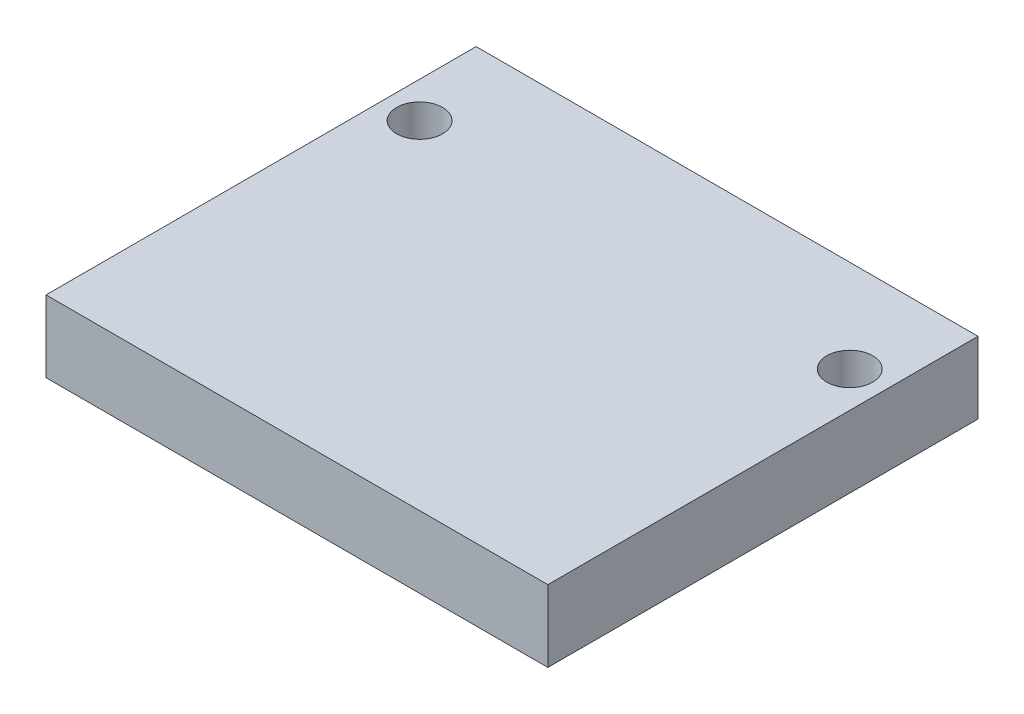
ISO-10303-21;
HEADER;
FILE_DESCRIPTION(('STEP AP214'),'2;1');
FILE_NAME('part.step','',(''),(''),'','','');
FILE_SCHEMA(('AUTOMOTIVE_DESIGN { 1 0 10303 214 1 1 1 1 }'));
ENDSEC;
DATA;
#1=APPLICATION_CONTEXT('core data for automotive mechanical design processes');
#2=APPLICATION_PROTOCOL_DEFINITION('international standard','automotive_design',2000,#1);
#3=PRODUCT_CONTEXT('',#1,'mechanical');
#4=PRODUCT('Part','Part','',(#3));
#5=PRODUCT_RELATED_PRODUCT_CATEGORY('part','',(#4));
#6=PRODUCT_DEFINITION_FORMATION('','',#4);
#7=PRODUCT_DEFINITION_CONTEXT('part definition',#1,'design');
#8=PRODUCT_DEFINITION('design','',#6,#7);
#9=PRODUCT_DEFINITION_SHAPE('','',#8);
#10=(LENGTH_UNIT() NAMED_UNIT(*) SI_UNIT(.MILLI.,.METRE.));
#11=(NAMED_UNIT(*) PLANE_ANGLE_UNIT() SI_UNIT($,.RADIAN.));
#12=(NAMED_UNIT(*) SI_UNIT($,.STERADIAN.) SOLID_ANGLE_UNIT());
#13=UNCERTAINTY_MEASURE_WITH_UNIT(LENGTH_MEASURE(1.E-05),#10,'distance_accuracy_value','');
#14=(GEOMETRIC_REPRESENTATION_CONTEXT(3) GLOBAL_UNCERTAINTY_ASSIGNED_CONTEXT((#13)) GLOBAL_UNIT_ASSIGNED_CONTEXT((#10,
#11,#12)) REPRESENTATION_CONTEXT('',''));
#15=CARTESIAN_POINT('',(0.,0.,0.));
#16=DIRECTION('',(0.,0.,1.));
#17=DIRECTION('',(1.,0.,0.));
#18=AXIS2_PLACEMENT_3D('',#15,#16,#17);
#19=CARTESIAN_POINT('',(17.5,2.5,30.));
#20=DIRECTION('',(-1.,0.,0.));
#21=DIRECTION('',(0.,0.,1.));
#22=AXIS2_PLACEMENT_3D('',#19,#20,#21);
#23=PLANE('',#22);
#24=DIRECTION('',(0.,1.,0.));
#25=VECTOR('',#24,1.);
#26=CARTESIAN_POINT('',(17.5,2.5,0.));
#27=LINE('',#26,#25);
#28=CARTESIAN_POINT('',(17.5,-2.5,0.));
#29=VERTEX_POINT('',#28);
#30=CARTESIAN_POINT('',(17.5,2.5,0.));
#31=VERTEX_POINT('',#30);
#32=EDGE_CURVE('E107',#29,#31,#27,.T.);
#33=ORIENTED_EDGE('',*,*,#32,.T.);
#34=DIRECTION('',(0.,0.,-1.));
#35=VECTOR('',#34,1.);
#36=CARTESIAN_POINT('',(17.5,2.5,30.));
#37=LINE('',#36,#35);
#38=CARTESIAN_POINT('',(17.5,2.5,30.));
#39=VERTEX_POINT('',#38);
#40=EDGE_CURVE('E11',#39,#31,#37,.T.);
#41=ORIENTED_EDGE('',*,*,#40,.F.);
#42=DIRECTION('',(0.,1.,0.));
#43=VECTOR('',#42,1.);
#44=CARTESIAN_POINT('',(17.5,2.5,30.));
#45=LINE('',#44,#43);
#46=CARTESIAN_POINT('',(17.5,-2.5,30.));
#47=VERTEX_POINT('',#46);
#48=EDGE_CURVE('E94',#47,#39,#45,.T.);
#49=ORIENTED_EDGE('',*,*,#48,.F.);
#50=DIRECTION('',(0.,0.,-1.));
#51=VECTOR('',#50,1.);
#52=CARTESIAN_POINT('',(17.5,-2.5,30.));
#53=LINE('',#52,#51);
#54=EDGE_CURVE('E103',#47,#29,#53,.T.);
#55=ORIENTED_EDGE('',*,*,#54,.T.);
#56=EDGE_LOOP('',(#33,#41,#49,#55));
#57=FACE_BOUND('',#56,.T.);
#58=ADVANCED_FACE('F41',(#57),#23,.F.);
#59=CARTESIAN_POINT('',(-17.5,2.5,30.));
#60=DIRECTION('',(0.,-1.,0.));
#61=DIRECTION('',(0.,0.,-1.));
#62=AXIS2_PLACEMENT_3D('',#59,#60,#61);
#63=PLANE('',#62);
#64=CARTESIAN_POINT('',(14.9999999999965,2.5,6.44504003723592));
#65=DIRECTION('',(0.,1.,0.));
#66=DIRECTION('',(0.,0.,1.));
#67=AXIS2_PLACEMENT_3D('',#64,#65,#66);
#68=CIRCLE('',#67,1.6);
#69=CARTESIAN_POINT('',(14.9999999999965,2.5,8.04504003723592));
#70=VERTEX_POINT('',#69);
#71=EDGE_CURVE('E116',#70,#70,#68,.T.);
#72=ORIENTED_EDGE('',*,*,#71,.F.);
#73=EDGE_LOOP('',(#72));
#74=FACE_BOUND('',#73,.T.);
#75=CARTESIAN_POINT('',(-15.0000000000035,2.5,6.44504003723609));
#76=DIRECTION('',(0.,1.,0.));
#77=DIRECTION('',(0.,0.,1.));
#78=AXIS2_PLACEMENT_3D('',#75,#76,#77);
#79=CIRCLE('',#78,1.6);
#80=CARTESIAN_POINT('',(-15.0000000000035,2.5,8.04504003723609));
#81=VERTEX_POINT('',#80);
#82=EDGE_CURVE('E121',#81,#81,#79,.T.);
#83=ORIENTED_EDGE('',*,*,#82,.F.);
#84=EDGE_LOOP('',(#83));
#85=FACE_BOUND('',#84,.T.);
#86=DIRECTION('',(-1.,0.,0.));
#87=VECTOR('',#86,1.);
#88=CARTESIAN_POINT('',(-17.5,2.5,0.));
#89=LINE('',#88,#87);
#90=CARTESIAN_POINT('',(-17.5,2.5,0.));
#91=VERTEX_POINT('',#90);
#92=EDGE_CURVE('E98',#31,#91,#89,.T.);
#93=ORIENTED_EDGE('',*,*,#92,.T.);
#94=DIRECTION('',(0.,0.,-1.));
#95=VECTOR('',#94,1.);
#96=CARTESIAN_POINT('',(-17.5,2.5,30.));
#97=LINE('',#96,#95);
#98=CARTESIAN_POINT('',(-17.5,2.5,30.));
#99=VERTEX_POINT('',#98);
#100=EDGE_CURVE('E50',#99,#91,#97,.T.);
#101=ORIENTED_EDGE('',*,*,#100,.F.);
#102=DIRECTION('',(-1.,0.,0.));
#103=VECTOR('',#102,1.);
#104=CARTESIAN_POINT('',(-17.5,2.5,30.));
#105=LINE('',#104,#103);
#106=EDGE_CURVE('E89',#39,#99,#105,.T.);
#107=ORIENTED_EDGE('',*,*,#106,.F.);
#108=ORIENTED_EDGE('',*,*,#40,.T.);
#109=EDGE_LOOP('',(#93,#101,#107,#108));
#110=FACE_BOUND('',#109,.T.);
#111=ADVANCED_FACE('F97',(#74,#85,#110),#63,.F.);
#112=CARTESIAN_POINT('',(-17.5,2.5,30.));
#113=DIRECTION('',(1.,0.,0.));
#114=DIRECTION('',(0.,0.,-1.));
#115=AXIS2_PLACEMENT_3D('',#112,#113,#114);
#116=PLANE('',#115);
#117=DIRECTION('',(0.,-1.,0.));
#118=VECTOR('',#117,1.);
#119=CARTESIAN_POINT('',(-17.5,2.5,0.));
#120=LINE('',#119,#118);
#121=CARTESIAN_POINT('',(-17.5,-2.5,0.));
#122=VERTEX_POINT('',#121);
#123=EDGE_CURVE('E76',#91,#122,#120,.T.);
#124=ORIENTED_EDGE('',*,*,#123,.T.);
#125=DIRECTION('',(0.,0.,-1.));
#126=VECTOR('',#125,1.);
#127=CARTESIAN_POINT('',(-17.5,-2.5,30.));
#128=LINE('',#127,#126);
#129=CARTESIAN_POINT('',(-17.5,-2.5,30.));
#130=VERTEX_POINT('',#129);
#131=EDGE_CURVE('E99',#130,#122,#128,.T.);
#132=ORIENTED_EDGE('',*,*,#131,.F.);
#133=DIRECTION('',(0.,-1.,0.));
#134=VECTOR('',#133,1.);
#135=CARTESIAN_POINT('',(-17.5,2.5,30.));
#136=LINE('',#135,#134);
#137=EDGE_CURVE('E92',#99,#130,#136,.T.);
#138=ORIENTED_EDGE('',*,*,#137,.F.);
#139=ORIENTED_EDGE('',*,*,#100,.T.);
#140=EDGE_LOOP('',(#124,#132,#138,#139));
#141=FACE_BOUND('',#140,.T.);
#142=ADVANCED_FACE('F101',(#141),#116,.F.);
#143=CARTESIAN_POINT('',(-17.5,-2.5,30.));
#144=DIRECTION('',(0.,1.,0.));
#145=DIRECTION('',(0.,0.,1.));
#146=AXIS2_PLACEMENT_3D('',#143,#144,#145);
#147=PLANE('',#146);
#148=CARTESIAN_POINT('',(14.9999999999965,-2.5,6.44504003723592));
#149=DIRECTION('',(0.,1.,0.));
#150=DIRECTION('',(0.,0.,1.));
#151=AXIS2_PLACEMENT_3D('',#148,#149,#150);
#152=CIRCLE('',#151,1.6);
#153=CARTESIAN_POINT('',(14.9999999999965,-2.5,8.04504003723592));
#154=VERTEX_POINT('',#153);
#155=EDGE_CURVE('E44',#154,#154,#152,.T.);
#156=ORIENTED_EDGE('',*,*,#155,.T.);
#157=EDGE_LOOP('',(#156));
#158=FACE_BOUND('',#157,.T.);
#159=CARTESIAN_POINT('',(-15.0000000000035,-2.5,6.44504003723609));
#160=DIRECTION('',(0.,1.,0.));
#161=DIRECTION('',(0.,0.,1.));
#162=AXIS2_PLACEMENT_3D('',#159,#160,#161);
#163=CIRCLE('',#162,1.6);
#164=CARTESIAN_POINT('',(-15.0000000000035,-2.5,8.04504003723609));
#165=VERTEX_POINT('',#164);
#166=EDGE_CURVE('E114',#165,#165,#163,.T.);
#167=ORIENTED_EDGE('',*,*,#166,.T.);
#168=EDGE_LOOP('',(#167));
#169=FACE_BOUND('',#168,.T.);
#170=DIRECTION('',(1.,0.,0.));
#171=VECTOR('',#170,1.);
#172=CARTESIAN_POINT('',(-17.5,-2.5,0.));
#173=LINE('',#172,#171);
#174=EDGE_CURVE('E82',#122,#29,#173,.T.);
#175=ORIENTED_EDGE('',*,*,#174,.T.);
#176=ORIENTED_EDGE('',*,*,#54,.F.);
#177=DIRECTION('',(1.,0.,0.));
#178=VECTOR('',#177,1.);
#179=CARTESIAN_POINT('',(-17.5,-2.5,30.));
#180=LINE('',#179,#178);
#181=EDGE_CURVE('E59',#130,#47,#180,.T.);
#182=ORIENTED_EDGE('',*,*,#181,.F.);
#183=ORIENTED_EDGE('',*,*,#131,.T.);
#184=EDGE_LOOP('',(#175,#176,#182,#183));
#185=FACE_BOUND('',#184,.T.);
#186=ADVANCED_FACE('F139',(#158,#169,#185),#147,.F.);
#187=CARTESIAN_POINT('',(0.,0.,30.));
#188=DIRECTION('',(0.,0.,1.));
#189=DIRECTION('',(1.,0.,0.));
#190=AXIS2_PLACEMENT_3D('',#187,#188,#189);
#191=PLANE('',#190);
#192=ORIENTED_EDGE('',*,*,#48,.T.);
#193=ORIENTED_EDGE('',*,*,#106,.T.);
#194=ORIENTED_EDGE('',*,*,#137,.T.);
#195=ORIENTED_EDGE('',*,*,#181,.T.);
#196=EDGE_LOOP('',(#192,#193,#194,#195));
#197=FACE_BOUND('',#196,.T.);
#198=ADVANCED_FACE('F90',(#197),#191,.T.);
#199=CARTESIAN_POINT('',(0.,0.,0.));
#200=DIRECTION('',(0.,0.,1.));
#201=DIRECTION('',(1.,0.,0.));
#202=AXIS2_PLACEMENT_3D('',#199,#200,#201);
#203=PLANE('',#202);
#204=ORIENTED_EDGE('',*,*,#32,.F.);
#205=ORIENTED_EDGE('',*,*,#174,.F.);
#206=ORIENTED_EDGE('',*,*,#123,.F.);
#207=ORIENTED_EDGE('',*,*,#92,.F.);
#208=EDGE_LOOP('',(#204,#205,#206,#207));
#209=FACE_BOUND('',#208,.T.);
#210=ADVANCED_FACE('F146',(#209),#203,.F.);
#211=CARTESIAN_POINT('',(-15.0000000000035,-7.5,6.44504003723609));
#212=DIRECTION('',(0.,1.,0.));
#213=DIRECTION('',(0.,0.,1.));
#214=AXIS2_PLACEMENT_3D('',#211,#212,#213);
#215=CYLINDRICAL_SURFACE('',#214,1.6);
#216=ORIENTED_EDGE('',*,*,#82,.T.);
#217=EDGE_LOOP('',(#216));
#218=FACE_BOUND('',#217,.T.);
#219=ORIENTED_EDGE('',*,*,#166,.F.);
#220=EDGE_LOOP('',(#219));
#221=FACE_BOUND('',#220,.T.);
#222=ADVANCED_FACE('F129',(#218,#221),#215,.F.);
#223=CARTESIAN_POINT('',(14.9999999999965,-7.5,6.44504003723592));
#224=DIRECTION('',(0.,1.,0.));
#225=DIRECTION('',(0.,0.,1.));
#226=AXIS2_PLACEMENT_3D('',#223,#224,#225);
#227=CYLINDRICAL_SURFACE('',#226,1.6);
#228=ORIENTED_EDGE('',*,*,#71,.T.);
#229=EDGE_LOOP('',(#228));
#230=FACE_BOUND('',#229,.T.);
#231=ORIENTED_EDGE('',*,*,#155,.F.);
#232=EDGE_LOOP('',(#231));
#233=FACE_BOUND('',#232,.T.);
#234=ADVANCED_FACE('F154',(#230,#233),#227,.F.);
#235=CLOSED_SHELL('',(#58,#111,#142,#186,#198,#210,#222,#234));
#236=MANIFOLD_SOLID_BREP('B2',#235);
#237=ADVANCED_BREP_SHAPE_REPRESENTATION('',(#18,#236),#14);
#238=SHAPE_DEFINITION_REPRESENTATION(#9,#237);
ENDSEC;
END-ISO-10303-21;
